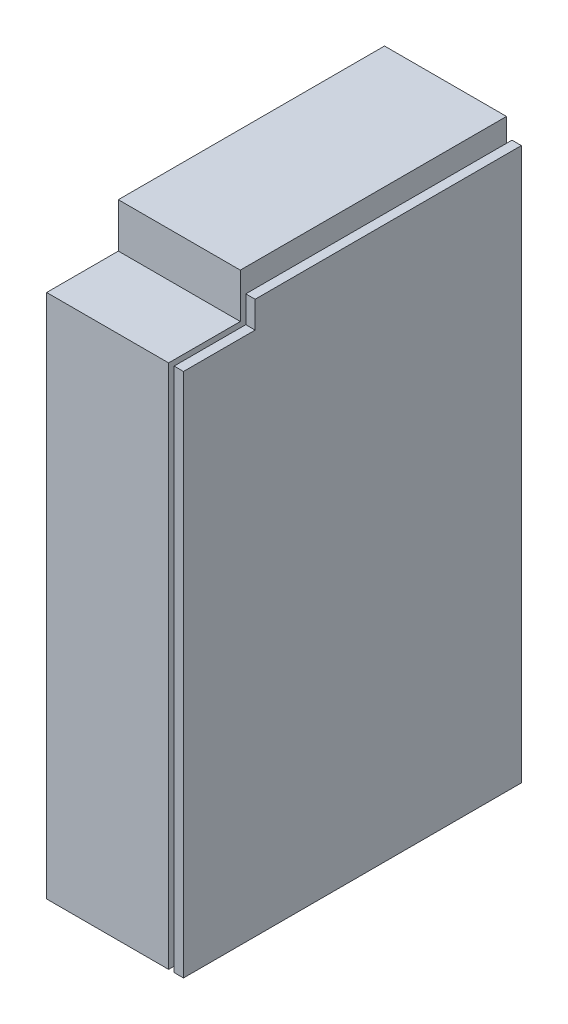
ISO-10303-21;
HEADER;
FILE_DESCRIPTION(('STEP AP214'),'2;1');
FILE_NAME('part.step','',(''),(''),'','','');
FILE_SCHEMA(('AUTOMOTIVE_DESIGN { 1 0 10303 214 1 1 1 1 }'));
ENDSEC;
DATA;
#1=APPLICATION_CONTEXT('core data for automotive mechanical design processes');
#2=APPLICATION_PROTOCOL_DEFINITION('international standard','automotive_design',2000,#1);
#3=PRODUCT_CONTEXT('',#1,'mechanical');
#4=PRODUCT('Part','Part','',(#3));
#5=PRODUCT_RELATED_PRODUCT_CATEGORY('part','',(#4));
#6=PRODUCT_DEFINITION_FORMATION('','',#4);
#7=PRODUCT_DEFINITION_CONTEXT('part definition',#1,'design');
#8=PRODUCT_DEFINITION('design','',#6,#7);
#9=PRODUCT_DEFINITION_SHAPE('','',#8);
#10=(LENGTH_UNIT() NAMED_UNIT(*) SI_UNIT(.MILLI.,.METRE.));
#11=(NAMED_UNIT(*) PLANE_ANGLE_UNIT() SI_UNIT($,.RADIAN.));
#12=(NAMED_UNIT(*) SI_UNIT($,.STERADIAN.) SOLID_ANGLE_UNIT());
#13=UNCERTAINTY_MEASURE_WITH_UNIT(LENGTH_MEASURE(1.E-05),#10,'distance_accuracy_value','');
#14=(GEOMETRIC_REPRESENTATION_CONTEXT(3) GLOBAL_UNCERTAINTY_ASSIGNED_CONTEXT((#13)) GLOBAL_UNIT_ASSIGNED_CONTEXT((#10,
#11,#12)) REPRESENTATION_CONTEXT('',''));
#15=CARTESIAN_POINT('',(0.,0.,0.));
#16=DIRECTION('',(0.,0.,1.));
#17=DIRECTION('',(1.,0.,0.));
#18=AXIS2_PLACEMENT_3D('',#15,#16,#17);
#19=CARTESIAN_POINT('',(16.04,0.,0.));
#20=DIRECTION('',(-1.,0.,0.));
#21=DIRECTION('',(0.,0.,1.));
#22=AXIS2_PLACEMENT_3D('',#19,#20,#21);
#23=PLANE('',#22);
#24=DIRECTION('',(0.,0.,-1.));
#25=VECTOR('',#24,1.);
#26=CARTESIAN_POINT('',(16.04,139.23,96.825));
#27=LINE('',#26,#25);
#28=CARTESIAN_POINT('',(16.04,139.23,96.825));
#29=VERTEX_POINT('',#28);
#30=CARTESIAN_POINT('',(16.04,139.23,0.42500000000029));
#31=VERTEX_POINT('',#30);
#32=EDGE_CURVE('P0_E140',#29,#31,#27,.T.);
#33=ORIENTED_EDGE('',*,*,#32,.F.);
#34=DIRECTION('',(0.,-1.,0.));
#35=VECTOR('',#34,1.);
#36=CARTESIAN_POINT('',(16.04,289.1,96.825));
#37=LINE('',#36,#35);
#38=CARTESIAN_POINT('',(16.04,289.1,96.825));
#39=VERTEX_POINT('',#38);
#40=EDGE_CURVE('P0_E27',#39,#29,#37,.T.);
#41=ORIENTED_EDGE('',*,*,#40,.F.);
#42=DIRECTION('',(0.,0.,1.));
#43=VECTOR('',#42,1.);
#44=CARTESIAN_POINT('',(16.04,289.1,76.375));
#45=LINE('',#44,#43);
#46=CARTESIAN_POINT('',(16.04,289.1,76.375));
#47=VERTEX_POINT('',#46);
#48=EDGE_CURVE('P0_E131',#47,#39,#45,.T.);
#49=ORIENTED_EDGE('',*,*,#48,.F.);
#50=DIRECTION('',(0.,1.,0.));
#51=VECTOR('',#50,1.);
#52=CARTESIAN_POINT('',(16.04,289.1,76.375));
#53=LINE('',#52,#51);
#54=CARTESIAN_POINT('',(16.04,296.72,76.375));
#55=VERTEX_POINT('',#54);
#56=EDGE_CURVE('P0_E111',#47,#55,#53,.T.);
#57=ORIENTED_EDGE('',*,*,#56,.T.);
#58=DIRECTION('',(0.,0.,1.));
#59=VECTOR('',#58,1.);
#60=CARTESIAN_POINT('',(16.04,296.72,0.42500000000029));
#61=LINE('',#60,#59);
#62=CARTESIAN_POINT('',(16.04,296.72,0.42500000000029));
#63=VERTEX_POINT('',#62);
#64=EDGE_CURVE('P0_E90',#63,#55,#61,.T.);
#65=ORIENTED_EDGE('',*,*,#64,.F.);
#66=DIRECTION('',(0.,1.,0.));
#67=VECTOR('',#66,1.);
#68=CARTESIAN_POINT('',(16.04,139.23,0.42500000000029));
#69=LINE('',#68,#67);
#70=EDGE_CURVE('P0_E143',#31,#63,#69,.T.);
#71=ORIENTED_EDGE('',*,*,#70,.F.);
#72=EDGE_LOOP('',(#33,#41,#49,#57,#65,#71));
#73=FACE_BOUND('',#72,.T.);
#74=ADVANCED_FACE('P0_F17',(#73),#23,.T.);
#75=CARTESIAN_POINT('',(18.71,0.,0.));
#76=DIRECTION('',(1.,0.,0.));
#77=DIRECTION('',(0.,0.,1.));
#78=AXIS2_PLACEMENT_3D('',#75,#76,#77);
#79=PLANE('',#78);
#80=DIRECTION('',(0.,0.,-1.));
#81=VECTOR('',#80,1.);
#82=CARTESIAN_POINT('',(18.71,139.23,96.825));
#83=LINE('',#82,#81);
#84=CARTESIAN_POINT('',(18.71,139.23,96.825));
#85=VERTEX_POINT('',#84);
#86=CARTESIAN_POINT('',(18.71,139.23,0.42500000000029));
#87=VERTEX_POINT('',#86);
#88=EDGE_CURVE('P0_E127',#85,#87,#83,.T.);
#89=ORIENTED_EDGE('',*,*,#88,.T.);
#90=DIRECTION('',(0.,1.,0.));
#91=VECTOR('',#90,1.);
#92=CARTESIAN_POINT('',(18.71,139.23,0.42500000000029));
#93=LINE('',#92,#91);
#94=CARTESIAN_POINT('',(18.71,296.72,0.42500000000029));
#95=VERTEX_POINT('',#94);
#96=EDGE_CURVE('P0_E20',#87,#95,#93,.T.);
#97=ORIENTED_EDGE('',*,*,#96,.T.);
#98=DIRECTION('',(0.,0.,1.));
#99=VECTOR('',#98,1.);
#100=CARTESIAN_POINT('',(18.71,296.72,0.42500000000029));
#101=LINE('',#100,#99);
#102=CARTESIAN_POINT('',(18.71,296.72,76.375));
#103=VERTEX_POINT('',#102);
#104=EDGE_CURVE('P0_E96',#95,#103,#101,.T.);
#105=ORIENTED_EDGE('',*,*,#104,.T.);
#106=DIRECTION('',(0.,1.,0.));
#107=VECTOR('',#106,1.);
#108=CARTESIAN_POINT('',(18.71,289.1,76.375));
#109=LINE('',#108,#107);
#110=CARTESIAN_POINT('',(18.71,289.1,76.375));
#111=VERTEX_POINT('',#110);
#112=EDGE_CURVE('P0_E100',#111,#103,#109,.T.);
#113=ORIENTED_EDGE('',*,*,#112,.F.);
#114=DIRECTION('',(0.,0.,1.));
#115=VECTOR('',#114,1.);
#116=CARTESIAN_POINT('',(18.71,289.1,76.375));
#117=LINE('',#116,#115);
#118=CARTESIAN_POINT('',(18.71,289.1,96.825));
#119=VERTEX_POINT('',#118);
#120=EDGE_CURVE('P0_E136',#111,#119,#117,.T.);
#121=ORIENTED_EDGE('',*,*,#120,.T.);
#122=DIRECTION('',(0.,-1.,0.));
#123=VECTOR('',#122,1.);
#124=CARTESIAN_POINT('',(18.71,289.1,96.825));
#125=LINE('',#124,#123);
#126=EDGE_CURVE('P0_E11',#119,#85,#125,.T.);
#127=ORIENTED_EDGE('',*,*,#126,.T.);
#128=EDGE_LOOP('',(#89,#97,#105,#113,#121,#127));
#129=FACE_BOUND('',#128,.T.);
#130=ADVANCED_FACE('P0_F97',(#129),#79,.T.);
#131=CARTESIAN_POINT('',(0.,0.,96.825));
#132=DIRECTION('',(0.,0.,1.));
#133=DIRECTION('',(1.,0.,0.));
#134=AXIS2_PLACEMENT_3D('',#131,#132,#133);
#135=PLANE('',#134);
#136=ORIENTED_EDGE('',*,*,#40,.T.);
#137=DIRECTION('',(1.,0.,0.));
#138=VECTOR('',#137,1.);
#139=CARTESIAN_POINT('',(16.04,139.23,96.825));
#140=LINE('',#139,#138);
#141=EDGE_CURVE('P0_E137',#29,#85,#140,.T.);
#142=ORIENTED_EDGE('',*,*,#141,.T.);
#143=ORIENTED_EDGE('',*,*,#126,.F.);
#144=DIRECTION('',(1.,0.,0.));
#145=VECTOR('',#144,1.);
#146=CARTESIAN_POINT('',(16.04,289.1,96.825));
#147=LINE('',#146,#145);
#148=EDGE_CURVE('P0_E128',#39,#119,#147,.T.);
#149=ORIENTED_EDGE('',*,*,#148,.F.);
#150=EDGE_LOOP('',(#136,#142,#143,#149));
#151=FACE_BOUND('',#150,.T.);
#152=ADVANCED_FACE('P0_F163',(#151),#135,.T.);
#153=CARTESIAN_POINT('',(0.,0.,0.42500000000029));
#154=DIRECTION('',(0.,0.,-1.));
#155=DIRECTION('',(0.,-1.,0.));
#156=AXIS2_PLACEMENT_3D('',#153,#154,#155);
#157=PLANE('',#156);
#158=ORIENTED_EDGE('',*,*,#70,.T.);
#159=DIRECTION('',(1.,0.,0.));
#160=VECTOR('',#159,1.);
#161=CARTESIAN_POINT('',(16.04,296.72,0.42500000000029));
#162=LINE('',#161,#160);
#163=EDGE_CURVE('P0_E103',#63,#95,#162,.T.);
#164=ORIENTED_EDGE('',*,*,#163,.T.);
#165=ORIENTED_EDGE('',*,*,#96,.F.);
#166=DIRECTION('',(1.,0.,0.));
#167=VECTOR('',#166,1.);
#168=CARTESIAN_POINT('',(16.04,139.23,0.42500000000029));
#169=LINE('',#168,#167);
#170=EDGE_CURVE('P0_E123',#31,#87,#169,.T.);
#171=ORIENTED_EDGE('',*,*,#170,.F.);
#172=EDGE_LOOP('',(#158,#164,#165,#171));
#173=FACE_BOUND('',#172,.T.);
#174=ADVANCED_FACE('P0_F165',(#173),#157,.T.);
#175=CARTESIAN_POINT('',(0.,139.23,0.));
#176=DIRECTION('',(0.,-1.,0.));
#177=DIRECTION('',(0.,0.,-1.));
#178=AXIS2_PLACEMENT_3D('',#175,#176,#177);
#179=PLANE('',#178);
#180=ORIENTED_EDGE('',*,*,#170,.T.);
#181=ORIENTED_EDGE('',*,*,#88,.F.);
#182=ORIENTED_EDGE('',*,*,#141,.F.);
#183=ORIENTED_EDGE('',*,*,#32,.T.);
#184=EDGE_LOOP('',(#180,#181,#182,#183));
#185=FACE_BOUND('',#184,.T.);
#186=ADVANCED_FACE('P0_F172',(#185),#179,.T.);
#187=CARTESIAN_POINT('',(0.,289.1,0.));
#188=DIRECTION('',(0.,1.,0.));
#189=DIRECTION('',(1.,0.,0.));
#190=AXIS2_PLACEMENT_3D('',#187,#188,#189);
#191=PLANE('',#190);
#192=ORIENTED_EDGE('',*,*,#120,.F.);
#193=DIRECTION('',(1.,0.,0.));
#194=VECTOR('',#193,1.);
#195=CARTESIAN_POINT('',(16.04,289.1,76.375));
#196=LINE('',#195,#194);
#197=EDGE_CURVE('P0_E115',#47,#111,#196,.T.);
#198=ORIENTED_EDGE('',*,*,#197,.F.);
#199=ORIENTED_EDGE('',*,*,#48,.T.);
#200=ORIENTED_EDGE('',*,*,#148,.T.);
#201=EDGE_LOOP('',(#192,#198,#199,#200));
#202=FACE_BOUND('',#201,.T.);
#203=ADVANCED_FACE('P0_F160',(#202),#191,.T.);
#204=CARTESIAN_POINT('',(0.,296.72,0.));
#205=DIRECTION('',(0.,1.,0.));
#206=DIRECTION('',(1.,0.,0.));
#207=AXIS2_PLACEMENT_3D('',#204,#205,#206);
#208=PLANE('',#207);
#209=ORIENTED_EDGE('',*,*,#64,.T.);
#210=DIRECTION('',(1.,0.,0.));
#211=VECTOR('',#210,1.);
#212=CARTESIAN_POINT('',(16.04,296.72,76.375));
#213=LINE('',#212,#211);
#214=EDGE_CURVE('P0_E106',#55,#103,#213,.T.);
#215=ORIENTED_EDGE('',*,*,#214,.T.);
#216=ORIENTED_EDGE('',*,*,#104,.F.);
#217=ORIENTED_EDGE('',*,*,#163,.F.);
#218=EDGE_LOOP('',(#209,#215,#216,#217));
#219=FACE_BOUND('',#218,.T.);
#220=ADVANCED_FACE('P0_F107',(#219),#208,.T.);
#221=CARTESIAN_POINT('',(0.,0.,76.375));
#222=DIRECTION('',(0.,0.,1.));
#223=DIRECTION('',(1.,0.,0.));
#224=AXIS2_PLACEMENT_3D('',#221,#222,#223);
#225=PLANE('',#224);
#226=ORIENTED_EDGE('',*,*,#197,.T.);
#227=ORIENTED_EDGE('',*,*,#112,.T.);
#228=ORIENTED_EDGE('',*,*,#214,.F.);
#229=ORIENTED_EDGE('',*,*,#56,.F.);
#230=EDGE_LOOP('',(#226,#227,#228,#229));
#231=FACE_BOUND('',#230,.T.);
#232=ADVANCED_FACE('P0_F113',(#231),#225,.T.);
#233=CLOSED_SHELL('',(#74,#130,#152,#174,#186,#203,#220,#232));
#234=MANIFOLD_SOLID_BREP('P0_B1',#233);
#235=CARTESIAN_POINT('',(0.,0.,0.425000000000284));
#236=DIRECTION('',(0.,0.,-1.));
#237=DIRECTION('',(0.,-1.,0.));
#238=AXIS2_PLACEMENT_3D('',#235,#236,#237);
#239=PLANE('',#238);
#240=DIRECTION('',(0.,1.,0.));
#241=VECTOR('',#240,1.);
#242=CARTESIAN_POINT('',(14.47,139.23,0.42500000000029));
#243=LINE('',#242,#241);
#244=CARTESIAN_POINT('',(14.47,139.23,0.42500000000029));
#245=VERTEX_POINT('',#244);
#246=CARTESIAN_POINT('',(14.47,301.8,0.42500000000029));
#247=VERTEX_POINT('',#246);
#248=EDGE_CURVE('P1_E143',#245,#247,#243,.T.);
#249=ORIENTED_EDGE('',*,*,#248,.F.);
#250=DIRECTION('',(-1.,0.,0.));
#251=VECTOR('',#250,1.);
#252=CARTESIAN_POINT('',(14.47,139.23,0.42500000000029));
#253=LINE('',#252,#251);
#254=CARTESIAN_POINT('',(-20.33,139.23,0.425000000000276));
#255=VERTEX_POINT('',#254);
#256=EDGE_CURVE('P1_E11',#245,#255,#253,.T.);
#257=ORIENTED_EDGE('',*,*,#256,.T.);
#258=DIRECTION('',(0.,1.,0.));
#259=VECTOR('',#258,1.);
#260=CARTESIAN_POINT('',(-20.33,139.23,0.425000000000276));
#261=LINE('',#260,#259);
#262=CARTESIAN_POINT('',(-20.33,301.8,0.425000000000276));
#263=VERTEX_POINT('',#262);
#264=EDGE_CURVE('P1_E100',#255,#263,#261,.T.);
#265=ORIENTED_EDGE('',*,*,#264,.T.);
#266=DIRECTION('',(-1.,0.,0.));
#267=VECTOR('',#266,1.);
#268=CARTESIAN_POINT('',(14.47,301.8,0.42500000000029));
#269=LINE('',#268,#267);
#270=EDGE_CURVE('P1_E42',#247,#263,#269,.T.);
#271=ORIENTED_EDGE('',*,*,#270,.F.);
#272=EDGE_LOOP('',(#249,#257,#265,#271));
#273=FACE_BOUND('',#272,.T.);
#274=ADVANCED_FACE('P1_F17',(#273),#239,.T.);
#275=CARTESIAN_POINT('',(0.,139.23,0.));
#276=DIRECTION('',(0.,-1.,0.));
#277=DIRECTION('',(0.,0.,-1.));
#278=AXIS2_PLACEMENT_3D('',#275,#276,#277);
#279=PLANE('',#278);
#280=ORIENTED_EDGE('',*,*,#256,.F.);
#281=DIRECTION('',(0.,0.,-1.));
#282=VECTOR('',#281,1.);
#283=CARTESIAN_POINT('',(14.47,139.23,96.825));
#284=LINE('',#283,#282);
#285=CARTESIAN_POINT('',(14.47,139.23,96.825));
#286=VERTEX_POINT('',#285);
#287=EDGE_CURVE('P1_E140',#286,#245,#284,.T.);
#288=ORIENTED_EDGE('',*,*,#287,.F.);
#289=DIRECTION('',(-1.,0.,0.));
#290=VECTOR('',#289,1.);
#291=CARTESIAN_POINT('',(14.47,139.23,96.825));
#292=LINE('',#291,#290);
#293=CARTESIAN_POINT('',(-20.33,139.23,96.825));
#294=VERTEX_POINT('',#293);
#295=EDGE_CURVE('P1_E28',#286,#294,#292,.T.);
#296=ORIENTED_EDGE('',*,*,#295,.T.);
#297=DIRECTION('',(0.,0.,-1.));
#298=VECTOR('',#297,1.);
#299=CARTESIAN_POINT('',(-20.33,139.23,96.825));
#300=LINE('',#299,#298);
#301=EDGE_CURVE('P1_E121',#294,#255,#300,.T.);
#302=ORIENTED_EDGE('',*,*,#301,.T.);
#303=EDGE_LOOP('',(#280,#288,#296,#302));
#304=FACE_BOUND('',#303,.T.);
#305=ADVANCED_FACE('P1_F163',(#304),#279,.T.);
#306=CARTESIAN_POINT('',(0.,0.,96.825));
#307=DIRECTION('',(0.,0.,1.));
#308=DIRECTION('',(1.,0.,0.));
#309=AXIS2_PLACEMENT_3D('',#306,#307,#308);
#310=PLANE('',#309);
#311=DIRECTION('',(0.,-1.,0.));
#312=VECTOR('',#311,1.);
#313=CARTESIAN_POINT('',(14.47,289.1,96.825));
#314=LINE('',#313,#312);
#315=CARTESIAN_POINT('',(14.47,289.1,96.825));
#316=VERTEX_POINT('',#315);
#317=EDGE_CURVE('P1_E64',#316,#286,#314,.T.);
#318=ORIENTED_EDGE('',*,*,#317,.F.);
#319=DIRECTION('',(-1.,0.,0.));
#320=VECTOR('',#319,1.);
#321=CARTESIAN_POINT('',(14.47,289.1,96.825));
#322=LINE('',#321,#320);
#323=CARTESIAN_POINT('',(-20.33,289.1,96.825));
#324=VERTEX_POINT('',#323);
#325=EDGE_CURVE('P1_E97',#316,#324,#322,.T.);
#326=ORIENTED_EDGE('',*,*,#325,.T.);
#327=DIRECTION('',(0.,-1.,0.));
#328=VECTOR('',#327,1.);
#329=CARTESIAN_POINT('',(-20.33,289.1,96.825));
#330=LINE('',#329,#328);
#331=EDGE_CURVE('P1_E125',#324,#294,#330,.T.);
#332=ORIENTED_EDGE('',*,*,#331,.T.);
#333=ORIENTED_EDGE('',*,*,#295,.F.);
#334=EDGE_LOOP('',(#318,#326,#332,#333));
#335=FACE_BOUND('',#334,.T.);
#336=ADVANCED_FACE('P1_F155',(#335),#310,.T.);
#337=CARTESIAN_POINT('',(0.,301.8,0.));
#338=DIRECTION('',(0.,1.,0.));
#339=DIRECTION('',(1.,0.,0.));
#340=AXIS2_PLACEMENT_3D('',#337,#338,#339);
#341=PLANE('',#340);
#342=DIRECTION('',(0.,0.,1.));
#343=VECTOR('',#342,1.);
#344=CARTESIAN_POINT('',(-20.33,301.8,0.425000000000276));
#345=LINE('',#344,#343);
#346=CARTESIAN_POINT('',(-20.33,301.8,76.375));
#347=VERTEX_POINT('',#346);
#348=EDGE_CURVE('P1_E131',#263,#347,#345,.T.);
#349=ORIENTED_EDGE('',*,*,#348,.T.);
#350=DIRECTION('',(-1.,0.,0.));
#351=VECTOR('',#350,1.);
#352=CARTESIAN_POINT('',(14.47,301.8,76.375));
#353=LINE('',#352,#351);
#354=CARTESIAN_POINT('',(14.47,301.8,76.375));
#355=VERTEX_POINT('',#354);
#356=EDGE_CURVE('P1_E110',#355,#347,#353,.T.);
#357=ORIENTED_EDGE('',*,*,#356,.F.);
#358=DIRECTION('',(0.,0.,1.));
#359=VECTOR('',#358,1.);
#360=CARTESIAN_POINT('',(14.47,301.8,0.42500000000029));
#361=LINE('',#360,#359);
#362=EDGE_CURVE('P1_E21',#247,#355,#361,.T.);
#363=ORIENTED_EDGE('',*,*,#362,.F.);
#364=ORIENTED_EDGE('',*,*,#270,.T.);
#365=EDGE_LOOP('',(#349,#357,#363,#364));
#366=FACE_BOUND('',#365,.T.);
#367=ADVANCED_FACE('P1_F166',(#366),#341,.T.);
#368=CARTESIAN_POINT('',(14.47,0.,0.));
#369=DIRECTION('',(1.,0.,0.));
#370=DIRECTION('',(0.,0.,1.));
#371=AXIS2_PLACEMENT_3D('',#368,#369,#370);
#372=PLANE('',#371);
#373=ORIENTED_EDGE('',*,*,#287,.T.);
#374=ORIENTED_EDGE('',*,*,#248,.T.);
#375=ORIENTED_EDGE('',*,*,#362,.T.);
#376=DIRECTION('',(0.,1.,0.));
#377=VECTOR('',#376,1.);
#378=CARTESIAN_POINT('',(14.47,289.1,76.375));
#379=LINE('',#378,#377);
#380=CARTESIAN_POINT('',(14.47,289.1,76.375));
#381=VERTEX_POINT('',#380);
#382=EDGE_CURVE('P1_E103',#381,#355,#379,.T.);
#383=ORIENTED_EDGE('',*,*,#382,.F.);
#384=DIRECTION('',(0.,0.,1.));
#385=VECTOR('',#384,1.);
#386=CARTESIAN_POINT('',(14.47,289.1,76.375));
#387=LINE('',#386,#385);
#388=EDGE_CURVE('P1_E91',#381,#316,#387,.T.);
#389=ORIENTED_EDGE('',*,*,#388,.T.);
#390=ORIENTED_EDGE('',*,*,#317,.T.);
#391=EDGE_LOOP('',(#373,#374,#375,#383,#389,#390));
#392=FACE_BOUND('',#391,.T.);
#393=ADVANCED_FACE('P1_F19',(#392),#372,.T.);
#394=CARTESIAN_POINT('',(0.,289.1,0.));
#395=DIRECTION('',(0.,1.,0.));
#396=DIRECTION('',(1.,0.,0.));
#397=AXIS2_PLACEMENT_3D('',#394,#395,#396);
#398=PLANE('',#397);
#399=ORIENTED_EDGE('',*,*,#388,.F.);
#400=DIRECTION('',(-1.,0.,0.));
#401=VECTOR('',#400,1.);
#402=CARTESIAN_POINT('',(14.47,289.1,76.375));
#403=LINE('',#402,#401);
#404=CARTESIAN_POINT('',(-20.33,289.1,76.375));
#405=VERTEX_POINT('',#404);
#406=EDGE_CURVE('P1_E96',#381,#405,#403,.T.);
#407=ORIENTED_EDGE('',*,*,#406,.T.);
#408=DIRECTION('',(0.,0.,1.));
#409=VECTOR('',#408,1.);
#410=CARTESIAN_POINT('',(-20.33,289.1,76.375));
#411=LINE('',#410,#409);
#412=EDGE_CURVE('P1_E130',#405,#324,#411,.T.);
#413=ORIENTED_EDGE('',*,*,#412,.T.);
#414=ORIENTED_EDGE('',*,*,#325,.F.);
#415=EDGE_LOOP('',(#399,#407,#413,#414));
#416=FACE_BOUND('',#415,.T.);
#417=ADVANCED_FACE('P1_F93',(#416),#398,.T.);
#418=CARTESIAN_POINT('',(-20.33,0.,0.));
#419=DIRECTION('',(-1.,0.,0.));
#420=DIRECTION('',(0.,0.,1.));
#421=AXIS2_PLACEMENT_3D('',#418,#419,#420);
#422=PLANE('',#421);
#423=ORIENTED_EDGE('',*,*,#301,.F.);
#424=ORIENTED_EDGE('',*,*,#331,.F.);
#425=ORIENTED_EDGE('',*,*,#412,.F.);
#426=DIRECTION('',(0.,1.,0.));
#427=VECTOR('',#426,1.);
#428=CARTESIAN_POINT('',(-20.33,289.1,76.375));
#429=LINE('',#428,#427);
#430=EDGE_CURVE('P1_E114',#405,#347,#429,.T.);
#431=ORIENTED_EDGE('',*,*,#430,.T.);
#432=ORIENTED_EDGE('',*,*,#348,.F.);
#433=ORIENTED_EDGE('',*,*,#264,.F.);
#434=EDGE_LOOP('',(#423,#424,#425,#431,#432,#433));
#435=FACE_BOUND('',#434,.T.);
#436=ADVANCED_FACE('P1_F159',(#435),#422,.T.);
#437=CARTESIAN_POINT('',(0.,0.,76.375));
#438=DIRECTION('',(0.,0.,1.));
#439=DIRECTION('',(1.,0.,0.));
#440=AXIS2_PLACEMENT_3D('',#437,#438,#439);
#441=PLANE('',#440);
#442=ORIENTED_EDGE('',*,*,#406,.F.);
#443=ORIENTED_EDGE('',*,*,#382,.T.);
#444=ORIENTED_EDGE('',*,*,#356,.T.);
#445=ORIENTED_EDGE('',*,*,#430,.F.);
#446=EDGE_LOOP('',(#442,#443,#444,#445));
#447=FACE_BOUND('',#446,.T.);
#448=ADVANCED_FACE('P1_F112',(#447),#441,.T.);
#449=CLOSED_SHELL('',(#274,#305,#336,#367,#393,#417,#436,#448));
#450=MANIFOLD_SOLID_BREP('P1_B1',#449);
#451=ADVANCED_BREP_SHAPE_REPRESENTATION('',(#18,#234,#450),#14);
#452=SHAPE_DEFINITION_REPRESENTATION(#9,#451);
ENDSEC;
END-ISO-10303-21;
